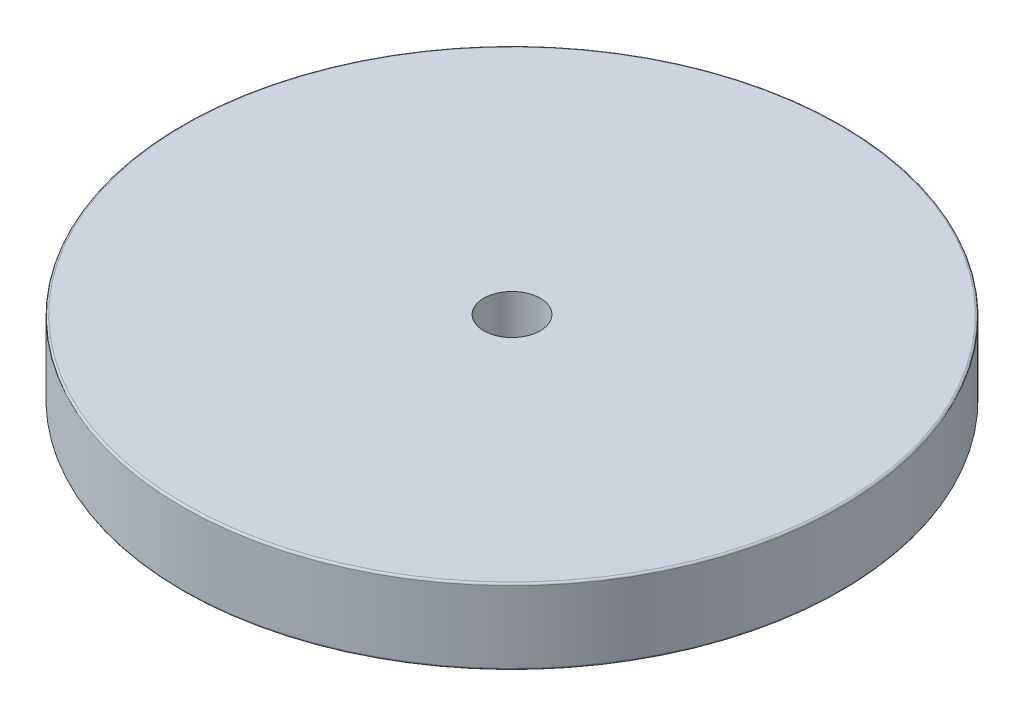
ISO-10303-21;
HEADER;
FILE_DESCRIPTION(('STEP AP214'),'2;1');
FILE_NAME('part.step','',(''),(''),'','','');
FILE_SCHEMA(('AUTOMOTIVE_DESIGN { 1 0 10303 214 1 1 1 1 }'));
ENDSEC;
DATA;
#1=APPLICATION_CONTEXT('core data for automotive mechanical design processes');
#2=APPLICATION_PROTOCOL_DEFINITION('international standard','automotive_design',2000,#1);
#3=PRODUCT_CONTEXT('',#1,'mechanical');
#4=PRODUCT('Part','Part','',(#3));
#5=PRODUCT_RELATED_PRODUCT_CATEGORY('part','',(#4));
#6=PRODUCT_DEFINITION_FORMATION('','',#4);
#7=PRODUCT_DEFINITION_CONTEXT('part definition',#1,'design');
#8=PRODUCT_DEFINITION('design','',#6,#7);
#9=PRODUCT_DEFINITION_SHAPE('','',#8);
#10=(LENGTH_UNIT() NAMED_UNIT(*) SI_UNIT(.MILLI.,.METRE.));
#11=(NAMED_UNIT(*) PLANE_ANGLE_UNIT() SI_UNIT($,.RADIAN.));
#12=(NAMED_UNIT(*) SI_UNIT($,.STERADIAN.) SOLID_ANGLE_UNIT());
#13=UNCERTAINTY_MEASURE_WITH_UNIT(LENGTH_MEASURE(1.E-05),#10,'distance_accuracy_value','');
#14=(GEOMETRIC_REPRESENTATION_CONTEXT(3) GLOBAL_UNCERTAINTY_ASSIGNED_CONTEXT((#13)) GLOBAL_UNIT_ASSIGNED_CONTEXT((#10,
#11,#12)) REPRESENTATION_CONTEXT('',''));
#15=CARTESIAN_POINT('',(0.,0.,0.));
#16=DIRECTION('',(0.,0.,1.));
#17=DIRECTION('',(1.,0.,0.));
#18=AXIS2_PLACEMENT_3D('',#15,#16,#17);
#19=CARTESIAN_POINT('',(0.,40.,0.));
#20=DIRECTION('',(0.,-1.,0.));
#21=DIRECTION('',(0.,0.,-1.));
#22=AXIS2_PLACEMENT_3D('',#19,#20,#21);
#23=CYLINDRICAL_SURFACE('',#22,175.);
#24=CARTESIAN_POINT('',(0.,1.,0.));
#25=DIRECTION('',(0.,1.,0.));
#26=DIRECTION('',(0.,0.,1.));
#27=AXIS2_PLACEMENT_3D('',#24,#25,#26);
#28=CIRCLE('',#27,175.);
#29=CARTESIAN_POINT('',(0.,1.,175.));
#30=VERTEX_POINT('',#29);
#31=EDGE_CURVE('E42',#30,#30,#28,.T.);
#32=ORIENTED_EDGE('',*,*,#31,.T.);
#33=EDGE_LOOP('',(#32));
#34=FACE_BOUND('',#33,.T.);
#35=CARTESIAN_POINT('',(0.,39.,0.));
#36=DIRECTION('',(0.,1.,0.));
#37=DIRECTION('',(0.,0.,1.));
#38=AXIS2_PLACEMENT_3D('',#35,#36,#37);
#39=CIRCLE('',#38,175.);
#40=CARTESIAN_POINT('',(0.,39.,175.));
#41=VERTEX_POINT('',#40);
#42=EDGE_CURVE('E46',#41,#41,#39,.F.);
#43=ORIENTED_EDGE('',*,*,#42,.T.);
#44=EDGE_LOOP('',(#43));
#45=FACE_BOUND('',#44,.T.);
#46=ADVANCED_FACE('F31',(#34,#45),#23,.T.);
#47=CARTESIAN_POINT('',(0.,40.,0.));
#48=DIRECTION('',(0.,1.,0.));
#49=DIRECTION('',(0.,0.,1.));
#50=AXIS2_PLACEMENT_3D('',#47,#48,#49);
#51=PLANE('',#50);
#52=CARTESIAN_POINT('',(0.,40.,0.));
#53=DIRECTION('',(0.,1.,0.));
#54=DIRECTION('',(0.,0.,1.));
#55=AXIS2_PLACEMENT_3D('',#52,#53,#54);
#56=CIRCLE('',#55,174.);
#57=CARTESIAN_POINT('',(0.,40.,174.));
#58=VERTEX_POINT('',#57);
#59=EDGE_CURVE('E10',#58,#58,#56,.T.);
#60=ORIENTED_EDGE('',*,*,#59,.T.);
#61=EDGE_LOOP('',(#60));
#62=FACE_BOUND('',#61,.T.);
#63=CARTESIAN_POINT('',(0.,40.,0.));
#64=DIRECTION('',(0.,1.,0.));
#65=DIRECTION('',(0.,0.,1.));
#66=AXIS2_PLACEMENT_3D('',#63,#64,#65);
#67=CIRCLE('',#66,15.);
#68=CARTESIAN_POINT('',(0.,40.,15.));
#69=VERTEX_POINT('',#68);
#70=EDGE_CURVE('E52',#69,#69,#67,.T.);
#71=ORIENTED_EDGE('',*,*,#70,.F.);
#72=EDGE_LOOP('',(#71));
#73=FACE_BOUND('',#72,.T.);
#74=ADVANCED_FACE('F67',(#62,#73),#51,.T.);
#75=CARTESIAN_POINT('',(0.,0.,0.));
#76=DIRECTION('',(0.,1.,0.));
#77=DIRECTION('',(0.,0.,1.));
#78=AXIS2_PLACEMENT_3D('',#75,#76,#77);
#79=PLANE('',#78);
#80=CARTESIAN_POINT('',(0.,0.,0.));
#81=DIRECTION('',(0.,1.,0.));
#82=DIRECTION('',(0.,0.,1.));
#83=AXIS2_PLACEMENT_3D('',#80,#81,#82);
#84=CIRCLE('',#83,174.);
#85=CARTESIAN_POINT('',(0.,0.,174.));
#86=VERTEX_POINT('',#85);
#87=EDGE_CURVE('E38',#86,#86,#84,.F.);
#88=ORIENTED_EDGE('',*,*,#87,.T.);
#89=EDGE_LOOP('',(#88));
#90=FACE_BOUND('',#89,.T.);
#91=CARTESIAN_POINT('',(0.,0.,0.));
#92=DIRECTION('',(0.,1.,0.));
#93=DIRECTION('',(0.,0.,1.));
#94=AXIS2_PLACEMENT_3D('',#91,#92,#93);
#95=CIRCLE('',#94,15.);
#96=CARTESIAN_POINT('',(0.,0.,15.));
#97=VERTEX_POINT('',#96);
#98=EDGE_CURVE('E51',#97,#97,#95,.T.);
#99=ORIENTED_EDGE('',*,*,#98,.T.);
#100=EDGE_LOOP('',(#99));
#101=FACE_BOUND('',#100,.T.);
#102=ADVANCED_FACE('F58',(#90,#101),#79,.F.);
#103=CARTESIAN_POINT('',(0.,0.,0.));
#104=DIRECTION('',(0.,1.,0.));
#105=DIRECTION('',(0.,0.,1.));
#106=AXIS2_PLACEMENT_3D('',#103,#104,#105);
#107=CYLINDRICAL_SURFACE('',#106,15.);
#108=ORIENTED_EDGE('',*,*,#98,.F.);
#109=EDGE_LOOP('',(#108));
#110=FACE_BOUND('',#109,.T.);
#111=ORIENTED_EDGE('',*,*,#70,.T.);
#112=EDGE_LOOP('',(#111));
#113=FACE_BOUND('',#112,.T.);
#114=ADVANCED_FACE('F60',(#110,#113),#107,.F.);
#115=CARTESIAN_POINT('',(0.,1.,0.));
#116=DIRECTION('',(0.,1.,0.));
#117=DIRECTION('',(0.,0.,1.));
#118=AXIS2_PLACEMENT_3D('',#115,#116,#117);
#119=TOROIDAL_SURFACE('',#118,174.,1.);
#120=ORIENTED_EDGE('',*,*,#87,.F.);
#121=EDGE_LOOP('',(#120));
#122=FACE_BOUND('',#121,.T.);
#123=ORIENTED_EDGE('',*,*,#31,.F.);
#124=EDGE_LOOP('',(#123));
#125=FACE_BOUND('',#124,.T.);
#126=ADVANCED_FACE('F63',(#122,#125),#119,.T.);
#127=CARTESIAN_POINT('',(0.,39.,0.));
#128=DIRECTION('',(0.,1.,0.));
#129=DIRECTION('',(0.,0.,1.));
#130=AXIS2_PLACEMENT_3D('',#127,#128,#129);
#131=TOROIDAL_SURFACE('',#130,174.,1.);
#132=ORIENTED_EDGE('',*,*,#42,.F.);
#133=EDGE_LOOP('',(#132));
#134=FACE_BOUND('',#133,.T.);
#135=ORIENTED_EDGE('',*,*,#59,.F.);
#136=EDGE_LOOP('',(#135));
#137=FACE_BOUND('',#136,.T.);
#138=ADVANCED_FACE('F33',(#134,#137),#131,.T.);
#139=CLOSED_SHELL('',(#46,#74,#102,#114,#126,#138));
#140=MANIFOLD_SOLID_BREP('B2',#139);
#141=ADVANCED_BREP_SHAPE_REPRESENTATION('',(#18,#140),#14);
#142=SHAPE_DEFINITION_REPRESENTATION(#9,#141);
ENDSEC;
END-ISO-10303-21;
